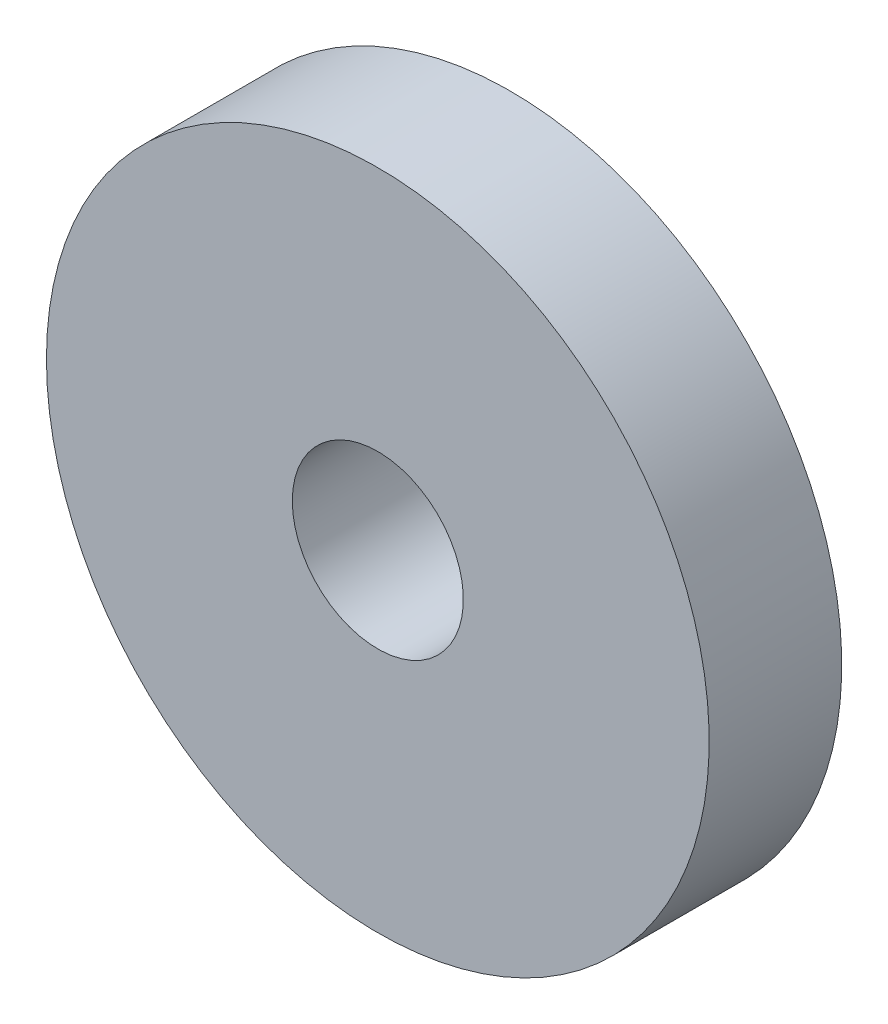
ISO-10303-21;
HEADER;
FILE_DESCRIPTION(('STEP AP214'),'2;1');
FILE_NAME('part.step','',(''),(''),'','','');
FILE_SCHEMA(('AUTOMOTIVE_DESIGN { 1 0 10303 214 1 1 1 1 }'));
ENDSEC;
DATA;
#1=APPLICATION_CONTEXT('core data for automotive mechanical design processes');
#2=APPLICATION_PROTOCOL_DEFINITION('international standard','automotive_design',2000,#1);
#3=PRODUCT_CONTEXT('',#1,'mechanical');
#4=PRODUCT('Part','Part','',(#3));
#5=PRODUCT_RELATED_PRODUCT_CATEGORY('part','',(#4));
#6=PRODUCT_DEFINITION_FORMATION('','',#4);
#7=PRODUCT_DEFINITION_CONTEXT('part definition',#1,'design');
#8=PRODUCT_DEFINITION('design','',#6,#7);
#9=PRODUCT_DEFINITION_SHAPE('','',#8);
#10=(LENGTH_UNIT() NAMED_UNIT(*) SI_UNIT(.MILLI.,.METRE.));
#11=(NAMED_UNIT(*) PLANE_ANGLE_UNIT() SI_UNIT($,.RADIAN.));
#12=(NAMED_UNIT(*) SI_UNIT($,.STERADIAN.) SOLID_ANGLE_UNIT());
#13=UNCERTAINTY_MEASURE_WITH_UNIT(LENGTH_MEASURE(1.E-05),#10,'distance_accuracy_value','');
#14=(GEOMETRIC_REPRESENTATION_CONTEXT(3) GLOBAL_UNCERTAINTY_ASSIGNED_CONTEXT((#13)) GLOBAL_UNIT_ASSIGNED_CONTEXT((#10,
#11,#12)) REPRESENTATION_CONTEXT('',''));
#15=CARTESIAN_POINT('',(0.,0.,0.));
#16=DIRECTION('',(0.,0.,1.));
#17=DIRECTION('',(1.,0.,0.));
#18=AXIS2_PLACEMENT_3D('',#15,#16,#17);
#19=CARTESIAN_POINT('',(0.,0.,6.2));
#20=DIRECTION('',(0.,0.,1.));
#21=DIRECTION('',(1.,0.,0.));
#22=AXIS2_PLACEMENT_3D('',#19,#20,#21);
#23=PLANE('',#22);
#24=CARTESIAN_POINT('',(0.,0.,6.2));
#25=DIRECTION('',(0.,0.,1.));
#26=DIRECTION('',(1.,0.,0.));
#27=AXIS2_PLACEMENT_3D('',#24,#25,#26);
#28=CIRCLE('',#27,15.5);
#29=CARTESIAN_POINT('',(-15.5,0.,6.2));
#30=VERTEX_POINT('',#29);
#31=EDGE_CURVE('E10',#30,#30,#28,.T.);
#32=ORIENTED_EDGE('',*,*,#31,.T.);
#33=EDGE_LOOP('',(#32));
#34=FACE_BOUND('',#33,.T.);
#35=CARTESIAN_POINT('',(0.,0.,6.2));
#36=DIRECTION('',(0.,0.,1.));
#37=DIRECTION('',(1.,0.,0.));
#38=AXIS2_PLACEMENT_3D('',#35,#36,#37);
#39=CIRCLE('',#38,4.);
#40=CARTESIAN_POINT('',(-4.,0.,6.2));
#41=VERTEX_POINT('',#40);
#42=EDGE_CURVE('E44',#41,#41,#39,.T.);
#43=ORIENTED_EDGE('',*,*,#42,.F.);
#44=EDGE_LOOP('',(#43));
#45=FACE_BOUND('',#44,.T.);
#46=ADVANCED_FACE('F33',(#34,#45),#23,.T.);
#47=CARTESIAN_POINT('',(0.,0.,0.));
#48=DIRECTION('',(0.,0.,1.));
#49=DIRECTION('',(1.,0.,0.));
#50=AXIS2_PLACEMENT_3D('',#47,#48,#49);
#51=PLANE('',#50);
#52=CARTESIAN_POINT('',(0.,0.,0.));
#53=DIRECTION('',(0.,0.,1.));
#54=DIRECTION('',(1.,0.,0.));
#55=AXIS2_PLACEMENT_3D('',#52,#53,#54);
#56=CIRCLE('',#55,15.5);
#57=CARTESIAN_POINT('',(-15.5,0.,0.));
#58=VERTEX_POINT('',#57);
#59=EDGE_CURVE('E37',#58,#58,#56,.T.);
#60=ORIENTED_EDGE('',*,*,#59,.F.);
#61=EDGE_LOOP('',(#60));
#62=FACE_BOUND('',#61,.T.);
#63=CARTESIAN_POINT('',(0.,0.,0.));
#64=DIRECTION('',(0.,0.,1.));
#65=DIRECTION('',(1.,0.,0.));
#66=AXIS2_PLACEMENT_3D('',#63,#64,#65);
#67=CIRCLE('',#66,4.);
#68=CARTESIAN_POINT('',(-4.,0.,0.));
#69=VERTEX_POINT('',#68);
#70=EDGE_CURVE('E46',#69,#69,#67,.T.);
#71=ORIENTED_EDGE('',*,*,#70,.T.);
#72=EDGE_LOOP('',(#71));
#73=FACE_BOUND('',#72,.T.);
#74=ADVANCED_FACE('F56',(#62,#73),#51,.F.);
#75=CARTESIAN_POINT('',(0.,0.,6.2));
#76=DIRECTION('',(0.,0.,-1.));
#77=DIRECTION('',(-1.,0.,0.));
#78=AXIS2_PLACEMENT_3D('',#75,#76,#77);
#79=CYLINDRICAL_SURFACE('',#78,15.5);
#80=CARTESIAN_POINT('',(-15.5,0.,6.2));
#81=CARTESIAN_POINT('',(-15.5,0.,6.13541666666667));
#82=CARTESIAN_POINT('',(-15.5,0.,6.07083333333333));
#83=CARTESIAN_POINT('',(-15.5,0.,5.94166666666667));
#84=CARTESIAN_POINT('',(-15.5,0.,5.87708333333333));
#85=CARTESIAN_POINT('',(-15.5,0.,5.74791666666667));
#86=CARTESIAN_POINT('',(-15.5,0.,5.68333333333333));
#87=CARTESIAN_POINT('',(-15.5,0.,5.55416666666667));
#88=CARTESIAN_POINT('',(-15.5,0.,5.48958333333333));
#89=CARTESIAN_POINT('',(-15.5,0.,5.36041666666667));
#90=CARTESIAN_POINT('',(-15.5,0.,5.29583333333333));
#91=CARTESIAN_POINT('',(-15.5,0.,5.16666666666667));
#92=CARTESIAN_POINT('',(-15.5,0.,5.10208333333333));
#93=CARTESIAN_POINT('',(-15.5,0.,4.97291666666667));
#94=CARTESIAN_POINT('',(-15.5,0.,4.90833333333333));
#95=CARTESIAN_POINT('',(-15.5,0.,4.77916666666667));
#96=CARTESIAN_POINT('',(-15.5,0.,4.71458333333333));
#97=CARTESIAN_POINT('',(-15.5,0.,4.58541666666667));
#98=CARTESIAN_POINT('',(-15.5,0.,4.52083333333333));
#99=CARTESIAN_POINT('',(-15.5,0.,4.39166666666667));
#100=CARTESIAN_POINT('',(-15.5,0.,4.32708333333333));
#101=CARTESIAN_POINT('',(-15.5,0.,4.19791666666667));
#102=CARTESIAN_POINT('',(-15.5,0.,4.13333333333333));
#103=CARTESIAN_POINT('',(-15.5,0.,4.00416666666667));
#104=CARTESIAN_POINT('',(-15.5,0.,3.93958333333333));
#105=CARTESIAN_POINT('',(-15.5,0.,3.81041666666667));
#106=CARTESIAN_POINT('',(-15.5,0.,3.74583333333333));
#107=CARTESIAN_POINT('',(-15.5,0.,3.61666666666667));
#108=CARTESIAN_POINT('',(-15.5,0.,3.55208333333333));
#109=CARTESIAN_POINT('',(-15.5,0.,3.42291666666667));
#110=CARTESIAN_POINT('',(-15.5,0.,3.35833333333333));
#111=CARTESIAN_POINT('',(-15.5,0.,3.22916666666667));
#112=CARTESIAN_POINT('',(-15.5,0.,3.16458333333333));
#113=CARTESIAN_POINT('',(-15.5,0.,3.03541666666667));
#114=CARTESIAN_POINT('',(-15.5,0.,2.97083333333333));
#115=CARTESIAN_POINT('',(-15.5,0.,2.84166666666667));
#116=CARTESIAN_POINT('',(-15.5,0.,2.77708333333333));
#117=CARTESIAN_POINT('',(-15.5,0.,2.64791666666667));
#118=CARTESIAN_POINT('',(-15.5,0.,2.58333333333333));
#119=CARTESIAN_POINT('',(-15.5,0.,2.45416666666667));
#120=CARTESIAN_POINT('',(-15.5,0.,2.38958333333333));
#121=CARTESIAN_POINT('',(-15.5,0.,2.26041666666667));
#122=CARTESIAN_POINT('',(-15.5,0.,2.19583333333333));
#123=CARTESIAN_POINT('',(-15.5,0.,2.06666666666667));
#124=CARTESIAN_POINT('',(-15.5,0.,2.00208333333333));
#125=CARTESIAN_POINT('',(-15.5,0.,1.87291666666667));
#126=CARTESIAN_POINT('',(-15.5,0.,1.80833333333333));
#127=CARTESIAN_POINT('',(-15.5,0.,1.67916666666667));
#128=CARTESIAN_POINT('',(-15.5,0.,1.61458333333333));
#129=CARTESIAN_POINT('',(-15.5,0.,1.48541666666667));
#130=CARTESIAN_POINT('',(-15.5,0.,1.42083333333333));
#131=CARTESIAN_POINT('',(-15.5,0.,1.29166666666667));
#132=CARTESIAN_POINT('',(-15.5,0.,1.22708333333333));
#133=CARTESIAN_POINT('',(-15.5,0.,1.09791666666667));
#134=CARTESIAN_POINT('',(-15.5,0.,1.03333333333333));
#135=CARTESIAN_POINT('',(-15.5,0.,0.904166666666667));
#136=CARTESIAN_POINT('',(-15.5,0.,0.839583333333333));
#137=CARTESIAN_POINT('',(-15.5,0.,0.710416666666666));
#138=CARTESIAN_POINT('',(-15.5,0.,0.645833333333333));
#139=CARTESIAN_POINT('',(-15.5,0.,0.516666666666667));
#140=CARTESIAN_POINT('',(-15.5,0.,0.452083333333333));
#141=CARTESIAN_POINT('',(-15.5,0.,0.322916666666667));
#142=CARTESIAN_POINT('',(-15.5,0.,0.258333333333334));
#143=CARTESIAN_POINT('',(-15.5,0.,0.129166666666667));
#144=CARTESIAN_POINT('',(-15.5,0.,0.0645833333333335));
#145=CARTESIAN_POINT('',(-15.5,0.,0.));
#146=B_SPLINE_CURVE_WITH_KNOTS('',3,(#80,#81,#82,#83,#84,#85,#86,#87,#88,#89,#90,#91,#92,#93,
#94,#95,#96,#97,#98,#99,#100,#101,#102,#103,#104,#105,#106,#107,#108,#109,#110,#111,#112,#113,
#114,#115,#116,#117,#118,#119,#120,#121,#122,#123,#124,#125,#126,#127,#128,#129,#130,#131,#132,
#133,#134,#135,#136,#137,#138,#139,#140,#141,#142,#143,#144,#145),.UNSPECIFIED.,.F.,.F.,(4,2,2,
2,2,2,2,2,2,2,2,2,2,2,2,2,2,2,2,2,2,2,2,2,2,2,2,2,2,2,2,2,4),(0.,0.19375,0.387500000000001,
0.58125,0.775,0.96875,1.1625,1.35625,1.55,1.74375,1.9375,2.13125,2.325,2.51875,2.7125,2.90625,
3.1,3.29375,3.4875,3.68125,3.875,4.06875,4.2625,4.45625,4.65,4.84375,5.0375,5.23125,5.425,
5.61875,5.8125,6.00625,6.2),.UNSPECIFIED.);
#147=EDGE_CURVE('BSEAM35',#30,#58,#146,.T.);
#148=ORIENTED_EDGE('',*,*,#31,.F.);
#149=ORIENTED_EDGE('',*,*,#59,.T.);
#150=ORIENTED_EDGE('',*,*,#147,.T.);
#151=ORIENTED_EDGE('',*,*,#147,.F.);
#152=EDGE_LOOP('',(#148,#150,#149,#151));
#153=FACE_BOUND('',#152,.T.);
#154=ADVANCED_FACE('F35',(#153),#79,.T.);
#155=CARTESIAN_POINT('',(0.,0.,6.2));
#156=DIRECTION('',(0.,0.,-1.));
#157=DIRECTION('',(-1.,0.,0.));
#158=AXIS2_PLACEMENT_3D('',#155,#156,#157);
#159=CYLINDRICAL_SURFACE('',#158,4.);
#160=CARTESIAN_POINT('',(-4.,0.,6.2));
#161=CARTESIAN_POINT('',(-4.,0.,6.13541666666667));
#162=CARTESIAN_POINT('',(-4.,0.,6.07083333333333));
#163=CARTESIAN_POINT('',(-4.,0.,5.94166666666667));
#164=CARTESIAN_POINT('',(-4.,0.,5.87708333333333));
#165=CARTESIAN_POINT('',(-4.,0.,5.74791666666667));
#166=CARTESIAN_POINT('',(-4.,0.,5.68333333333333));
#167=CARTESIAN_POINT('',(-4.,0.,5.55416666666667));
#168=CARTESIAN_POINT('',(-4.,0.,5.48958333333333));
#169=CARTESIAN_POINT('',(-4.,0.,5.36041666666667));
#170=CARTESIAN_POINT('',(-4.,0.,5.29583333333333));
#171=CARTESIAN_POINT('',(-4.,0.,5.16666666666667));
#172=CARTESIAN_POINT('',(-4.,0.,5.10208333333333));
#173=CARTESIAN_POINT('',(-4.,0.,4.97291666666667));
#174=CARTESIAN_POINT('',(-4.,0.,4.90833333333333));
#175=CARTESIAN_POINT('',(-4.,0.,4.77916666666667));
#176=CARTESIAN_POINT('',(-4.,0.,4.71458333333333));
#177=CARTESIAN_POINT('',(-4.,0.,4.58541666666667));
#178=CARTESIAN_POINT('',(-4.,0.,4.52083333333333));
#179=CARTESIAN_POINT('',(-4.,0.,4.39166666666667));
#180=CARTESIAN_POINT('',(-4.,0.,4.32708333333333));
#181=CARTESIAN_POINT('',(-4.,0.,4.19791666666667));
#182=CARTESIAN_POINT('',(-4.,0.,4.13333333333333));
#183=CARTESIAN_POINT('',(-4.,0.,4.00416666666667));
#184=CARTESIAN_POINT('',(-4.,0.,3.93958333333333));
#185=CARTESIAN_POINT('',(-4.,0.,3.81041666666667));
#186=CARTESIAN_POINT('',(-4.,0.,3.74583333333333));
#187=CARTESIAN_POINT('',(-4.,0.,3.61666666666667));
#188=CARTESIAN_POINT('',(-4.,0.,3.55208333333333));
#189=CARTESIAN_POINT('',(-4.,0.,3.42291666666667));
#190=CARTESIAN_POINT('',(-4.,0.,3.35833333333333));
#191=CARTESIAN_POINT('',(-4.,0.,3.22916666666667));
#192=CARTESIAN_POINT('',(-4.,0.,3.16458333333333));
#193=CARTESIAN_POINT('',(-4.,0.,3.03541666666667));
#194=CARTESIAN_POINT('',(-4.,0.,2.97083333333333));
#195=CARTESIAN_POINT('',(-4.,0.,2.84166666666667));
#196=CARTESIAN_POINT('',(-4.,0.,2.77708333333333));
#197=CARTESIAN_POINT('',(-4.,0.,2.64791666666667));
#198=CARTESIAN_POINT('',(-4.,0.,2.58333333333333));
#199=CARTESIAN_POINT('',(-4.,0.,2.45416666666667));
#200=CARTESIAN_POINT('',(-4.,0.,2.38958333333333));
#201=CARTESIAN_POINT('',(-4.,0.,2.26041666666667));
#202=CARTESIAN_POINT('',(-4.,0.,2.19583333333333));
#203=CARTESIAN_POINT('',(-4.,0.,2.06666666666667));
#204=CARTESIAN_POINT('',(-4.,0.,2.00208333333333));
#205=CARTESIAN_POINT('',(-4.,0.,1.87291666666667));
#206=CARTESIAN_POINT('',(-4.,0.,1.80833333333333));
#207=CARTESIAN_POINT('',(-4.,0.,1.67916666666667));
#208=CARTESIAN_POINT('',(-4.,0.,1.61458333333333));
#209=CARTESIAN_POINT('',(-4.,0.,1.48541666666667));
#210=CARTESIAN_POINT('',(-4.,0.,1.42083333333333));
#211=CARTESIAN_POINT('',(-4.,0.,1.29166666666667));
#212=CARTESIAN_POINT('',(-4.,0.,1.22708333333333));
#213=CARTESIAN_POINT('',(-4.,0.,1.09791666666667));
#214=CARTESIAN_POINT('',(-4.,0.,1.03333333333333));
#215=CARTESIAN_POINT('',(-4.,0.,0.904166666666667));
#216=CARTESIAN_POINT('',(-4.,0.,0.839583333333333));
#217=CARTESIAN_POINT('',(-4.,0.,0.710416666666666));
#218=CARTESIAN_POINT('',(-4.,0.,0.645833333333333));
#219=CARTESIAN_POINT('',(-4.,0.,0.516666666666667));
#220=CARTESIAN_POINT('',(-4.,0.,0.452083333333333));
#221=CARTESIAN_POINT('',(-4.,0.,0.322916666666667));
#222=CARTESIAN_POINT('',(-4.,0.,0.258333333333334));
#223=CARTESIAN_POINT('',(-4.,0.,0.129166666666667));
#224=CARTESIAN_POINT('',(-4.,0.,0.0645833333333335));
#225=CARTESIAN_POINT('',(-4.,0.,0.));
#226=B_SPLINE_CURVE_WITH_KNOTS('',3,(#160,#161,#162,#163,#164,#165,#166,#167,#168,#169,#170,
#171,#172,#173,#174,#175,#176,#177,#178,#179,#180,#181,#182,#183,#184,#185,#186,#187,#188,#189,
#190,#191,#192,#193,#194,#195,#196,#197,#198,#199,#200,#201,#202,#203,#204,#205,#206,#207,#208,
#209,#210,#211,#212,#213,#214,#215,#216,#217,#218,#219,#220,#221,#222,#223,#224,#225),
.UNSPECIFIED.,.F.,.F.,(4,2,2,2,2,2,2,2,2,2,2,2,2,2,2,2,2,2,2,2,2,2,2,2,2,2,2,2,2,2,2,2,4),(0.,
0.19375,0.387500000000001,0.58125,0.775,0.96875,1.1625,1.35625,1.55,1.74375,1.9375,2.13125,
2.325,2.51875,2.7125,2.90625,3.1,3.29375,3.4875,3.68125,3.875,4.06875,4.2625,4.45625,4.65,
4.84375,5.0375,5.23125,5.425,5.61875,5.8125,6.00625,6.2),.UNSPECIFIED.);
#227=EDGE_CURVE('BSEAM52',#41,#69,#226,.T.);
#228=ORIENTED_EDGE('',*,*,#42,.T.);
#229=ORIENTED_EDGE('',*,*,#70,.F.);
#230=ORIENTED_EDGE('',*,*,#227,.T.);
#231=ORIENTED_EDGE('',*,*,#227,.F.);
#232=EDGE_LOOP('',(#228,#230,#229,#231));
#233=FACE_BOUND('',#232,.T.);
#234=ADVANCED_FACE('F52',(#233),#159,.F.);
#235=CLOSED_SHELL('',(#46,#74,#154,#234));
#236=MANIFOLD_SOLID_BREP('B2',#235);
#237=ADVANCED_BREP_SHAPE_REPRESENTATION('',(#18,#236),#14);
#238=SHAPE_DEFINITION_REPRESENTATION(#9,#237);
ENDSEC;
END-ISO-10303-21;
